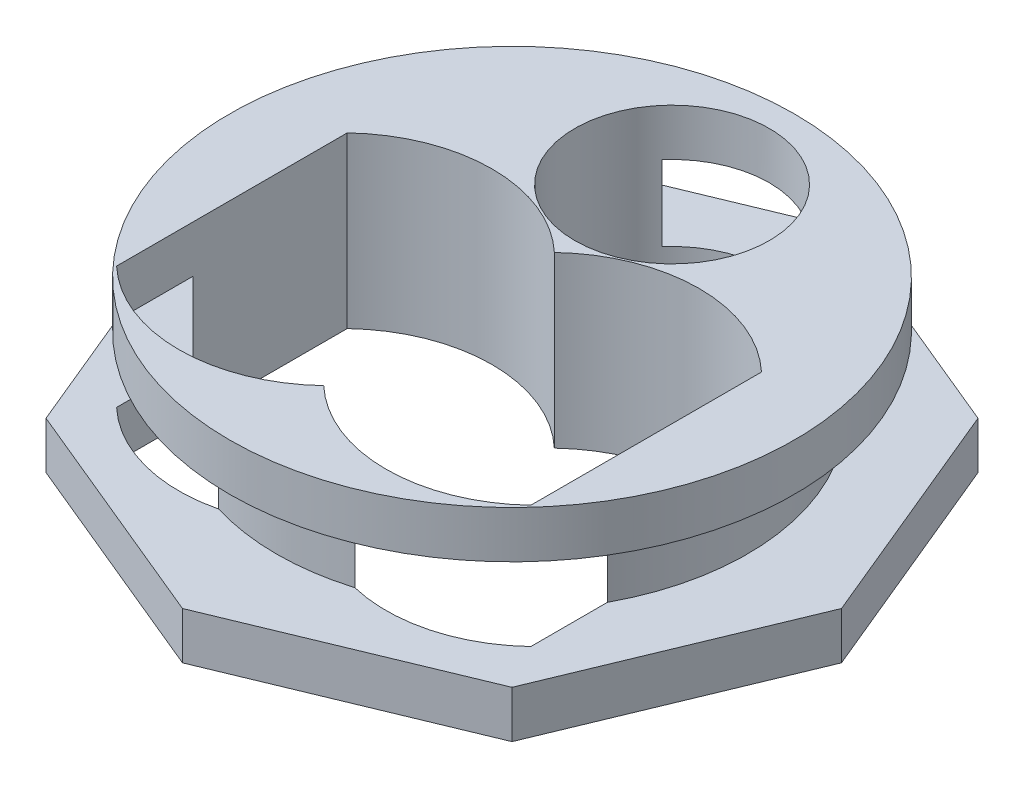
ISO-10303-21;
HEADER;
FILE_DESCRIPTION(('STEP AP214'),'2;1');
FILE_NAME('part.step','',(''),(''),'','','');
FILE_SCHEMA(('AUTOMOTIVE_DESIGN { 1 0 10303 214 1 1 1 1 }'));
ENDSEC;
DATA;
#1=APPLICATION_CONTEXT('core data for automotive mechanical design processes');
#2=APPLICATION_PROTOCOL_DEFINITION('international standard','automotive_design',2000,#1);
#3=PRODUCT_CONTEXT('',#1,'mechanical');
#4=PRODUCT('Part','Part','',(#3));
#5=PRODUCT_RELATED_PRODUCT_CATEGORY('part','',(#4));
#6=PRODUCT_DEFINITION_FORMATION('','',#4);
#7=PRODUCT_DEFINITION_CONTEXT('part definition',#1,'design');
#8=PRODUCT_DEFINITION('design','',#6,#7);
#9=PRODUCT_DEFINITION_SHAPE('','',#8);
#10=(LENGTH_UNIT() NAMED_UNIT(*) SI_UNIT(.MILLI.,.METRE.));
#11=(NAMED_UNIT(*) PLANE_ANGLE_UNIT() SI_UNIT($,.RADIAN.));
#12=(NAMED_UNIT(*) SI_UNIT($,.STERADIAN.) SOLID_ANGLE_UNIT());
#13=UNCERTAINTY_MEASURE_WITH_UNIT(LENGTH_MEASURE(1.E-05),#10,'distance_accuracy_value','');
#14=(GEOMETRIC_REPRESENTATION_CONTEXT(3) GLOBAL_UNCERTAINTY_ASSIGNED_CONTEXT((#13)) GLOBAL_UNIT_ASSIGNED_CONTEXT((#10,
#11,#12)) REPRESENTATION_CONTEXT('',''));
#15=CARTESIAN_POINT('',(0.,0.,0.));
#16=DIRECTION('',(0.,0.,1.));
#17=DIRECTION('',(1.,0.,0.));
#18=AXIS2_PLACEMENT_3D('',#15,#16,#17);
#19=CARTESIAN_POINT('',(0.,13.,0.));
#20=DIRECTION('',(0.,-1.,0.));
#21=DIRECTION('',(0.,0.,-1.));
#22=AXIS2_PLACEMENT_3D('',#19,#20,#21);
#23=CYLINDRICAL_SURFACE('',#22,25.);
#24=DIRECTION('',(0.,1.,0.));
#25=VECTOR('',#24,1.);
#26=CARTESIAN_POINT('',(7.2321351555148,-4.50000000000001,23.9310722929911));
#27=LINE('',#26,#25);
#28=CARTESIAN_POINT('',(7.2321351555148,13.,23.9310722929911));
#29=VERTEX_POINT('',#28);
#30=CARTESIAN_POINT('',(7.2321351555148,5.,23.9310722929911));
#31=VERTEX_POINT('',#30);
#32=EDGE_CURVE('E210',#29,#31,#27,.F.);
#33=ORIENTED_EDGE('',*,*,#32,.F.);
#34=CARTESIAN_POINT('',(0.,13.,0.));
#35=DIRECTION('',(0.,1.,0.));
#36=DIRECTION('',(0.,0.,1.));
#37=AXIS2_PLACEMENT_3D('',#34,#35,#36);
#38=CIRCLE('',#37,25.);
#39=CARTESIAN_POINT('',(-7.23213515551423,13.,23.9310722929913));
#40=VERTEX_POINT('',#39);
#41=EDGE_CURVE('E287',#40,#29,#38,.T.);
#42=ORIENTED_EDGE('',*,*,#41,.F.);
#43=DIRECTION('',(0.,1.,0.));
#44=VECTOR('',#43,1.);
#45=CARTESIAN_POINT('',(-7.23213515551423,-4.50000000000001,23.9310722929913));
#46=LINE('',#45,#44);
#47=CARTESIAN_POINT('',(-7.23213515551422,5.,23.9310722929913));
#48=VERTEX_POINT('',#47);
#49=EDGE_CURVE('E248',#40,#48,#46,.F.);
#50=ORIENTED_EDGE('',*,*,#49,.T.);
#51=CARTESIAN_POINT('',(0.,5.,0.));
#52=DIRECTION('',(0.,1.,0.));
#53=DIRECTION('',(0.,0.,1.));
#54=AXIS2_PLACEMENT_3D('',#51,#52,#53);
#55=CIRCLE('',#54,25.);
#56=EDGE_CURVE('E292',#48,#31,#55,.T.);
#57=ORIENTED_EDGE('',*,*,#56,.T.);
#58=EDGE_LOOP('',(#33,#42,#50,#57));
#59=FACE_BOUND('',#58,.T.);
#60=ADVANCED_FACE('F33',(#59),#23,.T.);
#61=DIRECTION('',(0.,-1.,0.));
#62=VECTOR('',#61,1.);
#63=CARTESIAN_POINT('',(22.0000000000003,13.,11.8743420870374));
#64=LINE('',#63,#62);
#65=CARTESIAN_POINT('',(22.0000000000003,5.,11.8743420870374));
#66=VERTEX_POINT('',#65);
#67=CARTESIAN_POINT('',(22.0000000000003,13.,11.8743420870374));
#68=VERTEX_POINT('',#67);
#69=EDGE_CURVE('E47',#66,#68,#64,.F.);
#70=ORIENTED_EDGE('',*,*,#69,.F.);
#71=CARTESIAN_POINT('',(7.8249158358441,5.,-23.7438558823531));
#72=VERTEX_POINT('',#71);
#73=EDGE_CURVE('E282',#66,#72,#55,.T.);
#74=ORIENTED_EDGE('',*,*,#73,.T.);
#75=DIRECTION('',(0.,-1.,0.));
#76=VECTOR('',#75,1.);
#77=CARTESIAN_POINT('',(7.8249158358441,5.42805552537795,-23.7438558823531));
#78=LINE('',#77,#76);
#79=CARTESIAN_POINT('',(7.8249158358441,13.,-23.7438558823531));
#80=VERTEX_POINT('',#79);
#81=EDGE_CURVE('E273',#80,#72,#78,.T.);
#82=ORIENTED_EDGE('',*,*,#81,.F.);
#83=EDGE_CURVE('E288',#68,#80,#38,.T.);
#84=ORIENTED_EDGE('',*,*,#83,.F.);
#85=EDGE_LOOP('',(#70,#74,#82,#84));
#86=FACE_BOUND('',#85,.T.);
#87=ADVANCED_FACE('F371',(#86),#23,.T.);
#88=CARTESIAN_POINT('',(0.,5.,0.));
#89=DIRECTION('',(0.,1.,0.));
#90=DIRECTION('',(0.,0.,1.));
#91=AXIS2_PLACEMENT_3D('',#88,#89,#90);
#92=PLANE('',#91);
#93=DIRECTION('',(0.382683432365079,0.,-0.923879532511291));
#94=VECTOR('',#93,1.);
#95=CARTESIAN_POINT('',(24.7487373415295,5.,24.7487373415289));
#96=LINE('',#95,#94);
#97=CARTESIAN_POINT('',(24.7487373415295,5.,24.7487373415289));
#98=VERTEX_POINT('',#97);
#99=CARTESIAN_POINT('',(35.,5.,-3.99787041078963E-13));
#100=VERTEX_POINT('',#99);
#101=EDGE_CURVE('E293',#98,#100,#96,.T.);
#102=ORIENTED_EDGE('',*,*,#101,.T.);
#103=DIRECTION('',(-0.3826834323651,0.,-0.923879532511282));
#104=VECTOR('',#103,1.);
#105=CARTESIAN_POINT('',(35.,5.,-3.99787041078963E-13));
#106=LINE('',#105,#104);
#107=CARTESIAN_POINT('',(24.7487373415289,5.,-24.7487373415295));
#108=VERTEX_POINT('',#107);
#109=EDGE_CURVE('E296',#100,#108,#106,.T.);
#110=ORIENTED_EDGE('',*,*,#109,.T.);
#111=DIRECTION('',(-0.923879532511291,0.,-0.382683432365079));
#112=VECTOR('',#111,1.);
#113=CARTESIAN_POINT('',(24.7487373415289,5.,-24.7487373415295));
#114=LINE('',#113,#112);
#115=CARTESIAN_POINT('',(-4.06544380709532E-13,5.,-35.));
#116=VERTEX_POINT('',#115);
#117=EDGE_CURVE('E299',#108,#116,#114,.T.);
#118=ORIENTED_EDGE('',*,*,#117,.T.);
#119=DIRECTION('',(-0.923879532511282,0.,0.3826834323651));
#120=VECTOR('',#119,1.);
#121=CARTESIAN_POINT('',(-4.06544380709532E-13,5.,-35.));
#122=LINE('',#121,#120);
#123=CARTESIAN_POINT('',(-24.7487373415295,5.,-24.7487373415289));
#124=VERTEX_POINT('',#123);
#125=EDGE_CURVE('E301',#116,#124,#122,.T.);
#126=ORIENTED_EDGE('',*,*,#125,.T.);
#127=DIRECTION('',(-0.382683432365079,0.,0.923879532511291));
#128=VECTOR('',#127,1.);
#129=CARTESIAN_POINT('',(-24.7487373415295,5.,-24.7487373415289));
#130=LINE('',#129,#128);
#131=CARTESIAN_POINT('',(-35.,5.,4.06574307873272E-13));
#132=VERTEX_POINT('',#131);
#133=EDGE_CURVE('E303',#124,#132,#130,.T.);
#134=ORIENTED_EDGE('',*,*,#133,.T.);
#135=DIRECTION('',(0.3826834323651,0.,0.923879532511282));
#136=VECTOR('',#135,1.);
#137=CARTESIAN_POINT('',(-35.,5.,4.06574307873272E-13));
#138=LINE('',#137,#136);
#139=CARTESIAN_POINT('',(-24.7487373415289,5.,24.7487373415295));
#140=VERTEX_POINT('',#139);
#141=EDGE_CURVE('E305',#132,#140,#138,.T.);
#142=ORIENTED_EDGE('',*,*,#141,.T.);
#143=DIRECTION('',(0.923879532511291,0.,0.382683432365079));
#144=VECTOR('',#143,1.);
#145=CARTESIAN_POINT('',(-24.7487373415289,5.,24.7487373415295));
#146=LINE('',#145,#144);
#147=CARTESIAN_POINT('',(4.00730791215742E-13,5.,35.));
#148=VERTEX_POINT('',#147);
#149=EDGE_CURVE('E307',#140,#148,#146,.T.);
#150=ORIENTED_EDGE('',*,*,#149,.T.);
#151=DIRECTION('',(0.923879532511282,0.,-0.3826834323651));
#152=VECTOR('',#151,1.);
#153=CARTESIAN_POINT('',(4.00730791215742E-13,5.,35.));
#154=LINE('',#153,#152);
#155=EDGE_CURVE('E309',#148,#98,#154,.T.);
#156=ORIENTED_EDGE('',*,*,#155,.T.);
#157=EDGE_LOOP('',(#102,#110,#118,#126,#134,#142,#150,#156));
#158=FACE_BOUND('',#157,.T.);
#159=DIRECTION('',(0.,0.,1.));
#160=VECTOR('',#159,1.);
#161=CARTESIAN_POINT('',(22.,5.,-5.24514386426061E-13));
#162=LINE('',#161,#160);
#163=CARTESIAN_POINT('',(22.0000000000005,4.99999999999998,19.9999999999995));
#164=VERTEX_POINT('',#163);
#165=EDGE_CURVE('E220',#66,#164,#162,.T.);
#166=ORIENTED_EDGE('',*,*,#165,.T.);
#167=CARTESIAN_POINT('',(11.0000000000004,5.,8.38104996137727));
#168=DIRECTION('',(0.,1.,0.));
#169=DIRECTION('',(0.,0.,1.));
#170=AXIS2_PLACEMENT_3D('',#167,#168,#169);
#171=CIRCLE('',#170,16.);
#172=EDGE_CURVE('E212',#164,#31,#171,.F.);
#173=ORIENTED_EDGE('',*,*,#172,.T.);
#174=ORIENTED_EDGE('',*,*,#56,.F.);
#175=CARTESIAN_POINT('',(-11.0000000000002,5.,8.38104996137753));
#176=DIRECTION('',(0.,1.,0.));
#177=DIRECTION('',(0.,0.,1.));
#178=AXIS2_PLACEMENT_3D('',#175,#176,#177);
#179=CIRCLE('',#178,16.);
#180=CARTESIAN_POINT('',(-22.,4.99999999999998,20.));
#181=VERTEX_POINT('',#180);
#182=EDGE_CURVE('E251',#181,#48,#179,.T.);
#183=ORIENTED_EDGE('',*,*,#182,.F.);
#184=DIRECTION('',(0.,0.,1.));
#185=VECTOR('',#184,1.);
#186=CARTESIAN_POINT('',(-22.,5.,0.));
#187=LINE('',#186,#185);
#188=CARTESIAN_POINT('',(-22.,5.,11.8743420870379));
#189=VERTEX_POINT('',#188);
#190=EDGE_CURVE('E243',#189,#181,#187,.T.);
#191=ORIENTED_EDGE('',*,*,#190,.F.);
#192=CARTESIAN_POINT('',(-7.82491583584538,5.,-23.7438558823527));
#193=VERTEX_POINT('',#192);
#194=EDGE_CURVE('E289',#193,#189,#55,.T.);
#195=ORIENTED_EDGE('',*,*,#194,.F.);
#196=CARTESIAN_POINT('',(-4.53944796211615E-13,5.,-17.));
#197=DIRECTION('',(0.,1.,0.));
#198=DIRECTION('',(0.,0.,1.));
#199=AXIS2_PLACEMENT_3D('',#196,#197,#198);
#200=CIRCLE('',#199,10.33);
#201=EDGE_CURVE('E276',#193,#72,#200,.F.);
#202=ORIENTED_EDGE('',*,*,#201,.T.);
#203=ORIENTED_EDGE('',*,*,#73,.F.);
#204=EDGE_LOOP('',(#166,#173,#174,#183,#191,#195,#202,#203));
#205=FACE_BOUND('',#204,.T.);
#206=ADVANCED_FACE('F375',(#158,#205),#92,.T.);
#207=CARTESIAN_POINT('',(0.,0.,0.));
#208=DIRECTION('',(0.,1.,0.));
#209=DIRECTION('',(0.,0.,1.));
#210=AXIS2_PLACEMENT_3D('',#207,#208,#209);
#211=PLANE('',#210);
#212=DIRECTION('',(0.382683432365079,0.,-0.923879532511291));
#213=VECTOR('',#212,1.);
#214=CARTESIAN_POINT('',(24.7487373415295,0.,24.7487373415289));
#215=LINE('',#214,#213);
#216=CARTESIAN_POINT('',(24.7487373415295,0.,24.7487373415289));
#217=VERTEX_POINT('',#216);
#218=CARTESIAN_POINT('',(35.,0.,-3.99787041078963E-13));
#219=VERTEX_POINT('',#218);
#220=EDGE_CURVE('E286',#217,#219,#215,.T.);
#221=ORIENTED_EDGE('',*,*,#220,.F.);
#222=DIRECTION('',(0.923879532511282,0.,-0.3826834323651));
#223=VECTOR('',#222,1.);
#224=CARTESIAN_POINT('',(4.00730791215742E-13,0.,35.));
#225=LINE('',#224,#223);
#226=CARTESIAN_POINT('',(4.00730791215742E-13,0.,35.));
#227=VERTEX_POINT('',#226);
#228=EDGE_CURVE('E297',#227,#217,#225,.T.);
#229=ORIENTED_EDGE('',*,*,#228,.F.);
#230=DIRECTION('',(0.923879532511291,0.,0.382683432365079));
#231=VECTOR('',#230,1.);
#232=CARTESIAN_POINT('',(-24.7487373415289,0.,24.7487373415295));
#233=LINE('',#232,#231);
#234=CARTESIAN_POINT('',(-24.7487373415289,0.,24.7487373415295));
#235=VERTEX_POINT('',#234);
#236=EDGE_CURVE('E324',#235,#227,#233,.T.);
#237=ORIENTED_EDGE('',*,*,#236,.F.);
#238=DIRECTION('',(0.3826834323651,0.,0.923879532511282));
#239=VECTOR('',#238,1.);
#240=CARTESIAN_POINT('',(-35.,0.,4.06574307873272E-13));
#241=LINE('',#240,#239);
#242=CARTESIAN_POINT('',(-35.,0.,4.06574307873272E-13));
#243=VERTEX_POINT('',#242);
#244=EDGE_CURVE('E322',#243,#235,#241,.T.);
#245=ORIENTED_EDGE('',*,*,#244,.F.);
#246=DIRECTION('',(-0.382683432365079,0.,0.923879532511291));
#247=VECTOR('',#246,1.);
#248=CARTESIAN_POINT('',(-24.7487373415295,0.,-24.7487373415289));
#249=LINE('',#248,#247);
#250=CARTESIAN_POINT('',(-24.7487373415295,0.,-24.7487373415289));
#251=VERTEX_POINT('',#250);
#252=EDGE_CURVE('E320',#251,#243,#249,.T.);
#253=ORIENTED_EDGE('',*,*,#252,.F.);
#254=DIRECTION('',(-0.923879532511282,0.,0.3826834323651));
#255=VECTOR('',#254,1.);
#256=CARTESIAN_POINT('',(-4.06544380709532E-13,0.,-35.));
#257=LINE('',#256,#255);
#258=CARTESIAN_POINT('',(-4.06544380709532E-13,0.,-35.));
#259=VERTEX_POINT('',#258);
#260=EDGE_CURVE('E318',#259,#251,#257,.T.);
#261=ORIENTED_EDGE('',*,*,#260,.F.);
#262=DIRECTION('',(-0.923879532511291,0.,-0.382683432365079));
#263=VECTOR('',#262,1.);
#264=CARTESIAN_POINT('',(24.7487373415289,0.,-24.7487373415295));
#265=LINE('',#264,#263);
#266=CARTESIAN_POINT('',(24.7487373415289,0.,-24.7487373415295));
#267=VERTEX_POINT('',#266);
#268=EDGE_CURVE('E316',#267,#259,#265,.T.);
#269=ORIENTED_EDGE('',*,*,#268,.F.);
#270=DIRECTION('',(-0.3826834323651,0.,-0.923879532511282));
#271=VECTOR('',#270,1.);
#272=CARTESIAN_POINT('',(35.,0.,-3.99787041078963E-13));
#273=LINE('',#272,#271);
#274=EDGE_CURVE('E314',#219,#267,#273,.T.);
#275=ORIENTED_EDGE('',*,*,#274,.F.);
#276=EDGE_LOOP('',(#221,#229,#237,#245,#253,#261,#269,#275));
#277=FACE_BOUND('',#276,.T.);
#278=CARTESIAN_POINT('',(-4.53944796211615E-13,0.,-17.));
#279=DIRECTION('',(0.,1.,0.));
#280=DIRECTION('',(0.,0.,1.));
#281=AXIS2_PLACEMENT_3D('',#278,#279,#280);
#282=CIRCLE('',#281,10.33);
#283=CARTESIAN_POINT('',(-4.53944796211615E-13,0.,-6.67));
#284=VERTEX_POINT('',#283);
#285=EDGE_CURVE('E279',#284,#284,#282,.F.);
#286=ORIENTED_EDGE('',*,*,#285,.F.);
#287=EDGE_LOOP('',(#286));
#288=FACE_BOUND('',#287,.T.);
#289=CARTESIAN_POINT('',(11.0000000000004,0.,8.38104996137727));
#290=DIRECTION('',(0.,1.,0.));
#291=DIRECTION('',(0.,0.,1.));
#292=AXIS2_PLACEMENT_3D('',#289,#290,#291);
#293=CIRCLE('',#292,16.);
#294=CARTESIAN_POINT('',(22.0000000000005,0.,19.9999999999995));
#295=VERTEX_POINT('',#294);
#296=CARTESIAN_POINT('',(-4.53944796211615E-13,0.,20.));
#297=VERTEX_POINT('',#296);
#298=EDGE_CURVE('E215',#295,#297,#293,.F.);
#299=ORIENTED_EDGE('',*,*,#298,.F.);
#300=DIRECTION('',(0.,0.,1.));
#301=VECTOR('',#300,1.);
#302=CARTESIAN_POINT('',(22.,0.,-5.24514386426061E-13));
#303=LINE('',#302,#301);
#304=CARTESIAN_POINT('',(21.9999999999999,0.,-4.50000000000052));
#305=VERTEX_POINT('',#304);
#306=EDGE_CURVE('E223',#305,#295,#303,.T.);
#307=ORIENTED_EDGE('',*,*,#306,.F.);
#308=CARTESIAN_POINT('',(11.0000000000004,0.,7.11895003862221));
#309=DIRECTION('',(0.,1.,0.));
#310=DIRECTION('',(0.,0.,1.));
#311=AXIS2_PLACEMENT_3D('',#308,#309,#310);
#312=CIRCLE('',#311,16.);
#313=CARTESIAN_POINT('',(3.46657762624466E-13,0.,-4.5));
#314=VERTEX_POINT('',#313);
#315=EDGE_CURVE('E217',#314,#305,#312,.F.);
#316=ORIENTED_EDGE('',*,*,#315,.F.);
#317=CARTESIAN_POINT('',(-11.0000000000002,0.,7.11895003862247));
#318=DIRECTION('',(0.,1.,0.));
#319=DIRECTION('',(0.,0.,1.));
#320=AXIS2_PLACEMENT_3D('',#317,#318,#319);
#321=CIRCLE('',#320,16.);
#322=CARTESIAN_POINT('',(-22.,0.,-4.5));
#323=VERTEX_POINT('',#322);
#324=EDGE_CURVE('E256',#314,#323,#321,.T.);
#325=ORIENTED_EDGE('',*,*,#324,.T.);
#326=DIRECTION('',(0.,0.,1.));
#327=VECTOR('',#326,1.);
#328=CARTESIAN_POINT('',(-22.,0.,0.));
#329=LINE('',#328,#327);
#330=CARTESIAN_POINT('',(-22.,0.,20.));
#331=VERTEX_POINT('',#330);
#332=EDGE_CURVE('E245',#323,#331,#329,.T.);
#333=ORIENTED_EDGE('',*,*,#332,.T.);
#334=CARTESIAN_POINT('',(-11.0000000000002,0.,8.38104996137753));
#335=DIRECTION('',(0.,1.,0.));
#336=DIRECTION('',(0.,0.,1.));
#337=AXIS2_PLACEMENT_3D('',#334,#335,#336);
#338=CIRCLE('',#337,16.);
#339=EDGE_CURVE('E253',#331,#297,#338,.T.);
#340=ORIENTED_EDGE('',*,*,#339,.T.);
#341=EDGE_LOOP('',(#299,#307,#316,#325,#333,#340));
#342=FACE_BOUND('',#341,.T.);
#343=ADVANCED_FACE('F383',(#277,#288,#342),#211,.F.);
#344=CARTESIAN_POINT('',(0.,18.,0.));
#345=DIRECTION('',(0.,1.,0.));
#346=DIRECTION('',(0.,0.,1.));
#347=AXIS2_PLACEMENT_3D('',#344,#345,#346);
#348=PLANE('',#347);
#349=CARTESIAN_POINT('',(-4.53944796211615E-13,18.,-17.));
#350=DIRECTION('',(0.,1.,0.));
#351=DIRECTION('',(0.,0.,1.));
#352=AXIS2_PLACEMENT_3D('',#349,#350,#351);
#353=CIRCLE('',#352,10.33);
#354=CARTESIAN_POINT('',(-4.53944796211615E-13,18.,-6.67));
#355=VERTEX_POINT('',#354);
#356=EDGE_CURVE('E259',#355,#355,#353,.T.);
#357=ORIENTED_EDGE('',*,*,#356,.F.);
#358=EDGE_LOOP('',(#357));
#359=FACE_BOUND('',#358,.T.);
#360=CARTESIAN_POINT('',(0.,18.,0.));
#361=DIRECTION('',(0.,1.,0.));
#362=DIRECTION('',(0.,0.,1.));
#363=AXIS2_PLACEMENT_3D('',#360,#361,#362);
#364=CIRCLE('',#363,30.);
#365=CARTESIAN_POINT('',(0.,18.,30.));
#366=VERTEX_POINT('',#365);
#367=EDGE_CURVE('E265',#366,#366,#364,.T.);
#368=ORIENTED_EDGE('',*,*,#367,.T.);
#369=EDGE_LOOP('',(#368));
#370=FACE_BOUND('',#369,.T.);
#371=DIRECTION('',(0.,0.,1.));
#372=VECTOR('',#371,1.);
#373=CARTESIAN_POINT('',(22.0000000000005,18.,19.9999999999995));
#374=LINE('',#373,#372);
#375=CARTESIAN_POINT('',(21.9999999999999,18.,-4.50000000000052));
#376=VERTEX_POINT('',#375);
#377=CARTESIAN_POINT('',(22.0000000000005,18.,19.9999999999995));
#378=VERTEX_POINT('',#377);
#379=EDGE_CURVE('E185',#376,#378,#374,.T.);
#380=ORIENTED_EDGE('',*,*,#379,.T.);
#381=CARTESIAN_POINT('',(11.0000000000004,18.,8.38104996137727));
#382=DIRECTION('',(0.,-1.,0.));
#383=DIRECTION('',(0.,0.,1.));
#384=AXIS2_PLACEMENT_3D('',#381,#382,#383);
#385=CIRCLE('',#384,16.);
#386=CARTESIAN_POINT('',(9.30776056598943E-13,18.,20.));
#387=VERTEX_POINT('',#386);
#388=EDGE_CURVE('E193',#378,#387,#385,.T.);
#389=ORIENTED_EDGE('',*,*,#388,.T.);
#390=CARTESIAN_POINT('',(-11.0000000000002,18.,8.38104996137753));
#391=DIRECTION('',(0.,1.,0.));
#392=DIRECTION('',(0.,0.,1.));
#393=AXIS2_PLACEMENT_3D('',#390,#391,#392);
#394=CIRCLE('',#393,16.);
#395=CARTESIAN_POINT('',(-22.,18.,20.));
#396=VERTEX_POINT('',#395);
#397=EDGE_CURVE('E225',#396,#387,#394,.T.);
#398=ORIENTED_EDGE('',*,*,#397,.F.);
#399=DIRECTION('',(0.,0.,1.));
#400=VECTOR('',#399,1.);
#401=CARTESIAN_POINT('',(-22.,18.,20.));
#402=LINE('',#401,#400);
#403=CARTESIAN_POINT('',(-22.,18.,-4.5));
#404=VERTEX_POINT('',#403);
#405=EDGE_CURVE('E230',#404,#396,#402,.T.);
#406=ORIENTED_EDGE('',*,*,#405,.F.);
#407=CARTESIAN_POINT('',(-11.0000000000002,18.,7.11895003862247));
#408=DIRECTION('',(0.,1.,0.));
#409=DIRECTION('',(0.,0.,-1.));
#410=AXIS2_PLACEMENT_3D('',#407,#408,#409);
#411=CIRCLE('',#410,16.);
#412=CARTESIAN_POINT('',(3.46657762624466E-13,18.,-4.5));
#413=VERTEX_POINT('',#412);
#414=EDGE_CURVE('E227',#413,#404,#411,.T.);
#415=ORIENTED_EDGE('',*,*,#414,.F.);
#416=CARTESIAN_POINT('',(11.0000000000004,18.,7.11895003862221));
#417=DIRECTION('',(0.,-1.,0.));
#418=DIRECTION('',(0.,0.,-1.));
#419=AXIS2_PLACEMENT_3D('',#416,#417,#418);
#420=CIRCLE('',#419,16.);
#421=EDGE_CURVE('E190',#413,#376,#420,.T.);
#422=ORIENTED_EDGE('',*,*,#421,.T.);
#423=EDGE_LOOP('',(#380,#389,#398,#406,#415,#422));
#424=FACE_BOUND('',#423,.T.);
#425=ADVANCED_FACE('F201',(#359,#370,#424),#348,.T.);
#426=CARTESIAN_POINT('',(0.,13.,0.));
#427=DIRECTION('',(0.,1.,0.));
#428=DIRECTION('',(0.,0.,1.));
#429=AXIS2_PLACEMENT_3D('',#426,#427,#428);
#430=PLANE('',#429);
#431=CARTESIAN_POINT('',(0.,13.,0.));
#432=DIRECTION('',(0.,1.,0.));
#433=DIRECTION('',(0.,0.,1.));
#434=AXIS2_PLACEMENT_3D('',#431,#432,#433);
#435=CIRCLE('',#434,30.);
#436=CARTESIAN_POINT('',(0.,13.,30.));
#437=VERTEX_POINT('',#436);
#438=EDGE_CURVE('E262',#437,#437,#435,.T.);
#439=ORIENTED_EDGE('',*,*,#438,.F.);
#440=EDGE_LOOP('',(#439));
#441=FACE_BOUND('',#440,.T.);
#442=CARTESIAN_POINT('',(11.0000000000004,13.,8.38104996137727));
#443=DIRECTION('',(0.,1.,0.));
#444=DIRECTION('',(0.,0.,1.));
#445=AXIS2_PLACEMENT_3D('',#442,#443,#444);
#446=CIRCLE('',#445,16.);
#447=CARTESIAN_POINT('',(22.0000000000005,13.,19.9999999999995));
#448=VERTEX_POINT('',#447);
#449=EDGE_CURVE('E207',#448,#29,#446,.F.);
#450=ORIENTED_EDGE('',*,*,#449,.F.);
#451=DIRECTION('',(0.,0.,1.));
#452=VECTOR('',#451,1.);
#453=CARTESIAN_POINT('',(22.,13.,-5.24514386426061E-13));
#454=LINE('',#453,#452);
#455=EDGE_CURVE('E11',#68,#448,#454,.T.);
#456=ORIENTED_EDGE('',*,*,#455,.F.);
#457=ORIENTED_EDGE('',*,*,#83,.T.);
#458=CARTESIAN_POINT('',(-4.53944796211615E-13,13.,-17.));
#459=DIRECTION('',(0.,1.,0.));
#460=DIRECTION('',(0.,0.,1.));
#461=AXIS2_PLACEMENT_3D('',#458,#459,#460);
#462=CIRCLE('',#461,10.33);
#463=CARTESIAN_POINT('',(-7.82491583584538,13.,-23.7438558823527));
#464=VERTEX_POINT('',#463);
#465=EDGE_CURVE('E260',#80,#464,#462,.T.);
#466=ORIENTED_EDGE('',*,*,#465,.T.);
#467=CARTESIAN_POINT('',(-22.,13.,11.8743420870379));
#468=VERTEX_POINT('',#467);
#469=EDGE_CURVE('E283',#464,#468,#38,.T.);
#470=ORIENTED_EDGE('',*,*,#469,.T.);
#471=DIRECTION('',(0.,0.,1.));
#472=VECTOR('',#471,1.);
#473=CARTESIAN_POINT('',(-22.,13.,0.));
#474=LINE('',#473,#472);
#475=CARTESIAN_POINT('',(-22.,13.,20.));
#476=VERTEX_POINT('',#475);
#477=EDGE_CURVE('E350',#468,#476,#474,.T.);
#478=ORIENTED_EDGE('',*,*,#477,.T.);
#479=CARTESIAN_POINT('',(-11.0000000000002,13.,8.38104996137753));
#480=DIRECTION('',(0.,1.,0.));
#481=DIRECTION('',(0.,0.,1.));
#482=AXIS2_PLACEMENT_3D('',#479,#480,#481);
#483=CIRCLE('',#482,16.);
#484=EDGE_CURVE('E41',#476,#40,#483,.T.);
#485=ORIENTED_EDGE('',*,*,#484,.T.);
#486=ORIENTED_EDGE('',*,*,#41,.T.);
#487=EDGE_LOOP('',(#450,#456,#457,#466,#470,#478,#485,#486));
#488=FACE_BOUND('',#487,.T.);
#489=ADVANCED_FACE('F356',(#441,#488),#430,.F.);
#490=ORIENTED_EDGE('',*,*,#194,.T.);
#491=DIRECTION('',(0.,-1.,0.));
#492=VECTOR('',#491,1.);
#493=CARTESIAN_POINT('',(-22.,13.,11.8743420870379));
#494=LINE('',#493,#492);
#495=EDGE_CURVE('E240',#189,#468,#494,.F.);
#496=ORIENTED_EDGE('',*,*,#495,.T.);
#497=ORIENTED_EDGE('',*,*,#469,.F.);
#498=DIRECTION('',(0.,-1.,0.));
#499=VECTOR('',#498,1.);
#500=CARTESIAN_POINT('',(-7.82491583584537,5.42805552537795,-23.7438558823527));
#501=LINE('',#500,#499);
#502=EDGE_CURVE('E268',#193,#464,#501,.F.);
#503=ORIENTED_EDGE('',*,*,#502,.F.);
#504=EDGE_LOOP('',(#490,#496,#497,#503));
#505=FACE_BOUND('',#504,.T.);
#506=ADVANCED_FACE('F405',(#505),#23,.T.);
#507=CARTESIAN_POINT('',(24.7487373415295,5.,24.7487373415289));
#508=DIRECTION('',(-0.923879532511291,0.,-0.382683432365079));
#509=DIRECTION('',(-0.382683432365079,0.,0.923879532511291));
#510=AXIS2_PLACEMENT_3D('',#507,#508,#509);
#511=PLANE('',#510);
#512=ORIENTED_EDGE('',*,*,#220,.T.);
#513=DIRECTION('',(0.,-1.,0.));
#514=VECTOR('',#513,1.);
#515=CARTESIAN_POINT('',(35.,5.,-3.99787041078963E-13));
#516=LINE('',#515,#514);
#517=EDGE_CURVE('E347',#100,#219,#516,.T.);
#518=ORIENTED_EDGE('',*,*,#517,.F.);
#519=ORIENTED_EDGE('',*,*,#101,.F.);
#520=DIRECTION('',(0.,-1.,0.));
#521=VECTOR('',#520,1.);
#522=CARTESIAN_POINT('',(24.7487373415295,5.,24.7487373415289));
#523=LINE('',#522,#521);
#524=EDGE_CURVE('E311',#98,#217,#523,.T.);
#525=ORIENTED_EDGE('',*,*,#524,.T.);
#526=EDGE_LOOP('',(#512,#518,#519,#525));
#527=FACE_BOUND('',#526,.T.);
#528=ADVANCED_FACE('F35',(#527),#511,.F.);
#529=CARTESIAN_POINT('',(35.,5.,-3.99787041078963E-13));
#530=DIRECTION('',(-0.923879532511282,0.,0.3826834323651));
#531=DIRECTION('',(0.3826834323651,0.,0.923879532511282));
#532=AXIS2_PLACEMENT_3D('',#529,#530,#531);
#533=PLANE('',#532);
#534=ORIENTED_EDGE('',*,*,#274,.T.);
#535=DIRECTION('',(0.,-1.,0.));
#536=VECTOR('',#535,1.);
#537=CARTESIAN_POINT('',(24.7487373415289,5.,-24.7487373415295));
#538=LINE('',#537,#536);
#539=EDGE_CURVE('E344',#108,#267,#538,.T.);
#540=ORIENTED_EDGE('',*,*,#539,.F.);
#541=ORIENTED_EDGE('',*,*,#109,.F.);
#542=ORIENTED_EDGE('',*,*,#517,.T.);
#543=EDGE_LOOP('',(#534,#540,#541,#542));
#544=FACE_BOUND('',#543,.T.);
#545=ADVANCED_FACE('F417',(#544),#533,.F.);
#546=CARTESIAN_POINT('',(24.7487373415289,5.,-24.7487373415295));
#547=DIRECTION('',(-0.382683432365079,0.,0.923879532511291));
#548=DIRECTION('',(0.923879532511291,0.,0.382683432365079));
#549=AXIS2_PLACEMENT_3D('',#546,#547,#548);
#550=PLANE('',#549);
#551=ORIENTED_EDGE('',*,*,#268,.T.);
#552=DIRECTION('',(0.,-1.,0.));
#553=VECTOR('',#552,1.);
#554=CARTESIAN_POINT('',(-4.06544380709532E-13,5.,-35.));
#555=LINE('',#554,#553);
#556=EDGE_CURVE('E341',#116,#259,#555,.T.);
#557=ORIENTED_EDGE('',*,*,#556,.F.);
#558=ORIENTED_EDGE('',*,*,#117,.F.);
#559=ORIENTED_EDGE('',*,*,#539,.T.);
#560=EDGE_LOOP('',(#551,#557,#558,#559));
#561=FACE_BOUND('',#560,.T.);
#562=ADVANCED_FACE('F459',(#561),#550,.F.);
#563=CARTESIAN_POINT('',(-4.06544380709532E-13,5.,-35.));
#564=DIRECTION('',(0.3826834323651,0.,0.923879532511282));
#565=DIRECTION('',(0.923879532511283,0.,-0.3826834323651));
#566=AXIS2_PLACEMENT_3D('',#563,#564,#565);
#567=PLANE('',#566);
#568=ORIENTED_EDGE('',*,*,#260,.T.);
#569=DIRECTION('',(0.,-1.,0.));
#570=VECTOR('',#569,1.);
#571=CARTESIAN_POINT('',(-24.7487373415295,5.,-24.7487373415289));
#572=LINE('',#571,#570);
#573=EDGE_CURVE('E338',#124,#251,#572,.T.);
#574=ORIENTED_EDGE('',*,*,#573,.F.);
#575=ORIENTED_EDGE('',*,*,#125,.F.);
#576=ORIENTED_EDGE('',*,*,#556,.T.);
#577=EDGE_LOOP('',(#568,#574,#575,#576));
#578=FACE_BOUND('',#577,.T.);
#579=ADVANCED_FACE('F455',(#578),#567,.F.);
#580=CARTESIAN_POINT('',(-24.7487373415295,5.,-24.7487373415289));
#581=DIRECTION('',(0.923879532511291,0.,0.382683432365079));
#582=DIRECTION('',(0.382683432365079,0.,-0.923879532511291));
#583=AXIS2_PLACEMENT_3D('',#580,#581,#582);
#584=PLANE('',#583);
#585=ORIENTED_EDGE('',*,*,#252,.T.);
#586=DIRECTION('',(0.,-1.,0.));
#587=VECTOR('',#586,1.);
#588=CARTESIAN_POINT('',(-35.,5.,4.06574307873272E-13));
#589=LINE('',#588,#587);
#590=EDGE_CURVE('E335',#132,#243,#589,.T.);
#591=ORIENTED_EDGE('',*,*,#590,.F.);
#592=ORIENTED_EDGE('',*,*,#133,.F.);
#593=ORIENTED_EDGE('',*,*,#573,.T.);
#594=EDGE_LOOP('',(#585,#591,#592,#593));
#595=FACE_BOUND('',#594,.T.);
#596=ADVANCED_FACE('F451',(#595),#584,.F.);
#597=CARTESIAN_POINT('',(-35.,5.,4.06574307873272E-13));
#598=DIRECTION('',(0.923879532511282,0.,-0.3826834323651));
#599=DIRECTION('',(-0.382683432365101,0.,-0.923879532511283));
#600=AXIS2_PLACEMENT_3D('',#597,#598,#599);
#601=PLANE('',#600);
#602=ORIENTED_EDGE('',*,*,#244,.T.);
#603=DIRECTION('',(0.,-1.,0.));
#604=VECTOR('',#603,1.);
#605=CARTESIAN_POINT('',(-24.7487373415289,5.,24.7487373415295));
#606=LINE('',#605,#604);
#607=EDGE_CURVE('E332',#140,#235,#606,.T.);
#608=ORIENTED_EDGE('',*,*,#607,.F.);
#609=ORIENTED_EDGE('',*,*,#141,.F.);
#610=ORIENTED_EDGE('',*,*,#590,.T.);
#611=EDGE_LOOP('',(#602,#608,#609,#610));
#612=FACE_BOUND('',#611,.T.);
#613=ADVANCED_FACE('F444',(#612),#601,.F.);
#614=CARTESIAN_POINT('',(-24.7487373415289,5.,24.7487373415295));
#615=DIRECTION('',(0.382683432365079,0.,-0.923879532511291));
#616=DIRECTION('',(-0.923879532511291,0.,-0.382683432365079));
#617=AXIS2_PLACEMENT_3D('',#614,#615,#616);
#618=PLANE('',#617);
#619=ORIENTED_EDGE('',*,*,#236,.T.);
#620=DIRECTION('',(0.,-1.,0.));
#621=VECTOR('',#620,1.);
#622=CARTESIAN_POINT('',(4.00730791215742E-13,5.,35.));
#623=LINE('',#622,#621);
#624=EDGE_CURVE('E329',#148,#227,#623,.T.);
#625=ORIENTED_EDGE('',*,*,#624,.F.);
#626=ORIENTED_EDGE('',*,*,#149,.F.);
#627=ORIENTED_EDGE('',*,*,#607,.T.);
#628=EDGE_LOOP('',(#619,#625,#626,#627));
#629=FACE_BOUND('',#628,.T.);
#630=ADVANCED_FACE('F438',(#629),#618,.F.);
#631=CARTESIAN_POINT('',(4.00730791215742E-13,5.,35.));
#632=DIRECTION('',(-0.3826834323651,0.,-0.923879532511282));
#633=DIRECTION('',(-0.923879532511282,0.,0.3826834323651));
#634=AXIS2_PLACEMENT_3D('',#631,#632,#633);
#635=PLANE('',#634);
#636=ORIENTED_EDGE('',*,*,#228,.T.);
#637=ORIENTED_EDGE('',*,*,#524,.F.);
#638=ORIENTED_EDGE('',*,*,#155,.F.);
#639=ORIENTED_EDGE('',*,*,#624,.T.);
#640=EDGE_LOOP('',(#636,#637,#638,#639));
#641=FACE_BOUND('',#640,.T.);
#642=ADVANCED_FACE('F434',(#641),#635,.F.);
#643=CARTESIAN_POINT('',(-4.53944796211615E-13,22.8561110507559,-17.));
#644=DIRECTION('',(0.,-1.,0.));
#645=DIRECTION('',(0.,0.,-1.));
#646=AXIS2_PLACEMENT_3D('',#643,#644,#645);
#647=CYLINDRICAL_SURFACE('',#646,10.33);
#648=ORIENTED_EDGE('',*,*,#502,.T.);
#649=ORIENTED_EDGE('',*,*,#465,.F.);
#650=ORIENTED_EDGE('',*,*,#81,.T.);
#651=ORIENTED_EDGE('',*,*,#201,.F.);
#652=EDGE_LOOP('',(#648,#649,#650,#651));
#653=FACE_BOUND('',#652,.T.);
#654=ORIENTED_EDGE('',*,*,#285,.T.);
#655=EDGE_LOOP('',(#654));
#656=FACE_BOUND('',#655,.T.);
#657=ORIENTED_EDGE('',*,*,#356,.T.);
#658=EDGE_LOOP('',(#657));
#659=FACE_BOUND('',#658,.T.);
#660=ADVANCED_FACE('F368',(#653,#656,#659),#647,.F.);
#661=CARTESIAN_POINT('',(0.,18.,0.));
#662=DIRECTION('',(0.,-1.,0.));
#663=DIRECTION('',(0.,0.,-1.));
#664=AXIS2_PLACEMENT_3D('',#661,#662,#663);
#665=CYLINDRICAL_SURFACE('',#664,30.);
#666=ORIENTED_EDGE('',*,*,#367,.F.);
#667=EDGE_LOOP('',(#666));
#668=FACE_BOUND('',#667,.T.);
#669=ORIENTED_EDGE('',*,*,#438,.T.);
#670=EDGE_LOOP('',(#669));
#671=FACE_BOUND('',#670,.T.);
#672=ADVANCED_FACE('F430',(#668,#671),#665,.T.);
#673=CARTESIAN_POINT('',(-11.0000000000002,-27.,7.11895003862247));
#674=DIRECTION('',(0.,1.,0.));
#675=DIRECTION('',(0.,0.,1.));
#676=AXIS2_PLACEMENT_3D('',#673,#674,#675);
#677=CYLINDRICAL_SURFACE('',#676,16.);
#678=DIRECTION('',(0.,1.,0.));
#679=VECTOR('',#678,1.);
#680=CARTESIAN_POINT('',(-4.53944796211615E-13,-27.,-4.5));
#681=LINE('',#680,#679);
#682=EDGE_CURVE('E236',#314,#413,#681,.T.);
#683=ORIENTED_EDGE('',*,*,#682,.T.);
#684=ORIENTED_EDGE('',*,*,#414,.T.);
#685=DIRECTION('',(0.,1.,0.));
#686=VECTOR('',#685,1.);
#687=CARTESIAN_POINT('',(-22.,-27.,-4.5));
#688=LINE('',#687,#686);
#689=EDGE_CURVE('E234',#323,#404,#688,.T.);
#690=ORIENTED_EDGE('',*,*,#689,.F.);
#691=ORIENTED_EDGE('',*,*,#324,.F.);
#692=EDGE_LOOP('',(#683,#684,#690,#691));
#693=FACE_BOUND('',#692,.T.);
#694=ADVANCED_FACE('F392',(#693),#677,.F.);
#695=CARTESIAN_POINT('',(-11.0000000000002,-27.,8.38104996137753));
#696=DIRECTION('',(0.,1.,0.));
#697=DIRECTION('',(0.,0.,1.));
#698=AXIS2_PLACEMENT_3D('',#695,#696,#697);
#699=CYLINDRICAL_SURFACE('',#698,16.);
#700=DIRECTION('',(0.,1.,0.));
#701=VECTOR('',#700,1.);
#702=CARTESIAN_POINT('',(-22.,-27.,20.));
#703=LINE('',#702,#701);
#704=EDGE_CURVE('E233',#331,#181,#703,.T.);
#705=ORIENTED_EDGE('',*,*,#704,.T.);
#706=ORIENTED_EDGE('',*,*,#182,.T.);
#707=ORIENTED_EDGE('',*,*,#49,.F.);
#708=ORIENTED_EDGE('',*,*,#484,.F.);
#709=EDGE_CURVE('E55',#476,#396,#703,.T.);
#710=ORIENTED_EDGE('',*,*,#709,.T.);
#711=ORIENTED_EDGE('',*,*,#397,.T.);
#712=DIRECTION('',(0.,1.,0.));
#713=VECTOR('',#712,1.);
#714=CARTESIAN_POINT('',(-4.53944796211615E-13,-27.,20.));
#715=LINE('',#714,#713);
#716=EDGE_CURVE('E196',#297,#387,#715,.T.);
#717=ORIENTED_EDGE('',*,*,#716,.F.);
#718=ORIENTED_EDGE('',*,*,#339,.F.);
#719=EDGE_LOOP('',(#705,#706,#707,#708,#710,#711,#717,#718));
#720=FACE_BOUND('',#719,.T.);
#721=ADVANCED_FACE('F386',(#720),#699,.F.);
#722=CARTESIAN_POINT('',(-22.,-27.,20.));
#723=DIRECTION('',(-1.,0.,0.));
#724=DIRECTION('',(0.,0.,1.));
#725=AXIS2_PLACEMENT_3D('',#722,#723,#724);
#726=PLANE('',#725);
#727=ORIENTED_EDGE('',*,*,#689,.T.);
#728=ORIENTED_EDGE('',*,*,#405,.T.);
#729=ORIENTED_EDGE('',*,*,#709,.F.);
#730=ORIENTED_EDGE('',*,*,#477,.F.);
#731=ORIENTED_EDGE('',*,*,#495,.F.);
#732=ORIENTED_EDGE('',*,*,#190,.T.);
#733=ORIENTED_EDGE('',*,*,#704,.F.);
#734=ORIENTED_EDGE('',*,*,#332,.F.);
#735=EDGE_LOOP('',(#727,#728,#729,#730,#731,#732,#733,#734));
#736=FACE_BOUND('',#735,.T.);
#737=ADVANCED_FACE('F389',(#736),#726,.F.);
#738=CARTESIAN_POINT('',(22.0000000000005,-27.,19.9999999999995));
#739=DIRECTION('',(-1.,0.,0.));
#740=DIRECTION('',(0.,0.,1.));
#741=AXIS2_PLACEMENT_3D('',#738,#739,#740);
#742=PLANE('',#741);
#743=ORIENTED_EDGE('',*,*,#306,.T.);
#744=DIRECTION('',(0.,1.,0.));
#745=VECTOR('',#744,1.);
#746=CARTESIAN_POINT('',(22.0000000000005,-27.,19.9999999999995));
#747=LINE('',#746,#745);
#748=EDGE_CURVE('E189',#295,#164,#747,.T.);
#749=ORIENTED_EDGE('',*,*,#748,.T.);
#750=ORIENTED_EDGE('',*,*,#165,.F.);
#751=ORIENTED_EDGE('',*,*,#69,.T.);
#752=ORIENTED_EDGE('',*,*,#455,.T.);
#753=EDGE_CURVE('E180',#448,#378,#747,.T.);
#754=ORIENTED_EDGE('',*,*,#753,.T.);
#755=ORIENTED_EDGE('',*,*,#379,.F.);
#756=DIRECTION('',(0.,1.,0.));
#757=VECTOR('',#756,1.);
#758=CARTESIAN_POINT('',(21.9999999999999,-27.,-4.50000000000052));
#759=LINE('',#758,#757);
#760=EDGE_CURVE('E206',#305,#376,#759,.T.);
#761=ORIENTED_EDGE('',*,*,#760,.F.);
#762=EDGE_LOOP('',(#743,#749,#750,#751,#752,#754,#755,#761));
#763=FACE_BOUND('',#762,.T.);
#764=ADVANCED_FACE('F182',(#763),#742,.T.);
#765=CARTESIAN_POINT('',(11.0000000000004,-27.,7.11895003862221));
#766=DIRECTION('',(0.,1.,0.));
#767=DIRECTION('',(0.,0.,1.));
#768=AXIS2_PLACEMENT_3D('',#765,#766,#767);
#769=CYLINDRICAL_SURFACE('',#768,16.);
#770=ORIENTED_EDGE('',*,*,#315,.T.);
#771=ORIENTED_EDGE('',*,*,#760,.T.);
#772=ORIENTED_EDGE('',*,*,#421,.F.);
#773=ORIENTED_EDGE('',*,*,#682,.F.);
#774=EDGE_LOOP('',(#770,#771,#772,#773));
#775=FACE_BOUND('',#774,.T.);
#776=ADVANCED_FACE('F394',(#775),#769,.F.);
#777=CARTESIAN_POINT('',(11.0000000000004,-27.,8.38104996137727));
#778=DIRECTION('',(0.,1.,0.));
#779=DIRECTION('',(0.,0.,1.));
#780=AXIS2_PLACEMENT_3D('',#777,#778,#779);
#781=CYLINDRICAL_SURFACE('',#780,16.);
#782=ORIENTED_EDGE('',*,*,#298,.T.);
#783=ORIENTED_EDGE('',*,*,#716,.T.);
#784=ORIENTED_EDGE('',*,*,#388,.F.);
#785=ORIENTED_EDGE('',*,*,#753,.F.);
#786=ORIENTED_EDGE('',*,*,#449,.T.);
#787=ORIENTED_EDGE('',*,*,#32,.T.);
#788=ORIENTED_EDGE('',*,*,#172,.F.);
#789=ORIENTED_EDGE('',*,*,#748,.F.);
#790=EDGE_LOOP('',(#782,#783,#784,#785,#786,#787,#788,#789));
#791=FACE_BOUND('',#790,.T.);
#792=ADVANCED_FACE('F194',(#791),#781,.F.);
#793=CLOSED_SHELL('',(#60,#87,#206,#343,#425,#489,#506,#528,#545,#562,#579,#596,#613,#630,#642,
#660,#672,#694,#721,#737,#764,#776,#792));
#794=MANIFOLD_SOLID_BREP('B2',#793);
#795=ADVANCED_BREP_SHAPE_REPRESENTATION('',(#18,#794),#14);
#796=SHAPE_DEFINITION_REPRESENTATION(#9,#795);
ENDSEC;
END-ISO-10303-21;
